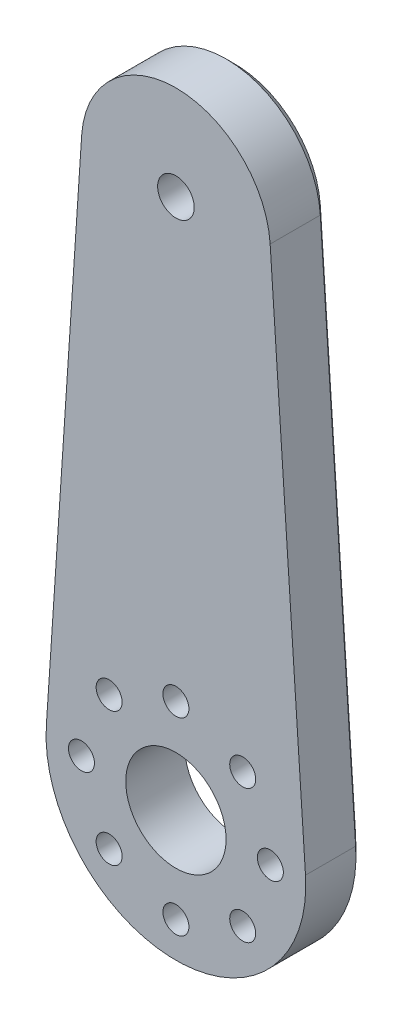
ISO-10303-21;
HEADER;
FILE_DESCRIPTION(('STEP AP214'),'2;1');
FILE_NAME('part.step','',(''),(''),'','','');
FILE_SCHEMA(('AUTOMOTIVE_DESIGN { 1 0 10303 214 1 1 1 1 }'));
ENDSEC;
DATA;
#1=APPLICATION_CONTEXT('core data for automotive mechanical design processes');
#2=APPLICATION_PROTOCOL_DEFINITION('international standard','automotive_design',2000,#1);
#3=PRODUCT_CONTEXT('',#1,'mechanical');
#4=PRODUCT('Part','Part','',(#3));
#5=PRODUCT_RELATED_PRODUCT_CATEGORY('part','',(#4));
#6=PRODUCT_DEFINITION_FORMATION('','',#4);
#7=PRODUCT_DEFINITION_CONTEXT('part definition',#1,'design');
#8=PRODUCT_DEFINITION('design','',#6,#7);
#9=PRODUCT_DEFINITION_SHAPE('','',#8);
#10=(LENGTH_UNIT() NAMED_UNIT(*) SI_UNIT(.MILLI.,.METRE.));
#11=(NAMED_UNIT(*) PLANE_ANGLE_UNIT() SI_UNIT($,.RADIAN.));
#12=(NAMED_UNIT(*) SI_UNIT($,.STERADIAN.) SOLID_ANGLE_UNIT());
#13=UNCERTAINTY_MEASURE_WITH_UNIT(LENGTH_MEASURE(1.E-05),#10,'distance_accuracy_value','');
#14=(GEOMETRIC_REPRESENTATION_CONTEXT(3) GLOBAL_UNCERTAINTY_ASSIGNED_CONTEXT((#13)) GLOBAL_UNIT_ASSIGNED_CONTEXT((#10,
#11,#12)) REPRESENTATION_CONTEXT('',''));
#15=CARTESIAN_POINT('',(0.,0.,0.));
#16=DIRECTION('',(0.,0.,1.));
#17=DIRECTION('',(1.,0.,0.));
#18=AXIS2_PLACEMENT_3D('',#15,#16,#17);
#19=CARTESIAN_POINT('',(-7.13363961110591,-19.1572369352093,5.));
#20=DIRECTION('',(0.,0.,-1.));
#21=DIRECTION('',(-1.,0.,0.));
#22=AXIS2_PLACEMENT_3D('',#19,#20,#21);
#23=CYLINDRICAL_SURFACE('',#22,1.1);
#24=CARTESIAN_POINT('',(-7.13363961110591,-19.1572369352093,5.));
#25=DIRECTION('',(0.,0.,1.));
#26=DIRECTION('',(1.,0.,0.));
#27=AXIS2_PLACEMENT_3D('',#24,#25,#26);
#28=CIRCLE('',#27,1.1);
#29=CARTESIAN_POINT('',(-6.03363961110591,-19.1572369352093,5.));
#30=VERTEX_POINT('',#29);
#31=EDGE_CURVE('E181',#30,#30,#28,.T.);
#32=ORIENTED_EDGE('',*,*,#31,.T.);
#33=EDGE_LOOP('',(#32));
#34=FACE_BOUND('',#33,.T.);
#35=CARTESIAN_POINT('',(-7.13363961110591,-19.1572369352093,2.25));
#36=DIRECTION('',(0.,0.,-1.));
#37=DIRECTION('',(-1.,0.,0.));
#38=AXIS2_PLACEMENT_3D('',#35,#36,#37);
#39=CIRCLE('',#38,1.1);
#40=CARTESIAN_POINT('',(-8.23363961110591,-19.1572369352093,2.25));
#41=VERTEX_POINT('',#40);
#42=EDGE_CURVE('E234',#41,#41,#39,.T.);
#43=ORIENTED_EDGE('',*,*,#42,.T.);
#44=EDGE_LOOP('',(#43));
#45=FACE_BOUND('',#44,.T.);
#46=ADVANCED_FACE('F35',(#34,#45),#23,.F.);
#47=CARTESIAN_POINT('',(-9.47678536161353,-24.8140911847017,5.));
#48=DIRECTION('',(0.,0.,-1.));
#49=DIRECTION('',(-1.,0.,0.));
#50=AXIS2_PLACEMENT_3D('',#47,#48,#49);
#51=CYLINDRICAL_SURFACE('',#50,1.1);
#52=CARTESIAN_POINT('',(-9.47678536161353,-24.8140911847017,5.));
#53=DIRECTION('',(0.,0.,1.));
#54=DIRECTION('',(1.,0.,0.));
#55=AXIS2_PLACEMENT_3D('',#52,#53,#54);
#56=CIRCLE('',#55,1.1);
#57=CARTESIAN_POINT('',(-8.37678536161353,-24.8140911847017,5.));
#58=VERTEX_POINT('',#57);
#59=EDGE_CURVE('E178',#58,#58,#56,.T.);
#60=ORIENTED_EDGE('',*,*,#59,.T.);
#61=EDGE_LOOP('',(#60));
#62=FACE_BOUND('',#61,.T.);
#63=CARTESIAN_POINT('',(-9.47678536161353,-24.8140911847017,2.25));
#64=DIRECTION('',(0.,0.,-1.));
#65=DIRECTION('',(-1.,0.,0.));
#66=AXIS2_PLACEMENT_3D('',#63,#64,#65);
#67=CIRCLE('',#66,1.1);
#68=CARTESIAN_POINT('',(-10.5767853616135,-24.8140911847017,2.25));
#69=VERTEX_POINT('',#68);
#70=EDGE_CURVE('E231',#69,#69,#67,.T.);
#71=ORIENTED_EDGE('',*,*,#70,.T.);
#72=EDGE_LOOP('',(#71));
#73=FACE_BOUND('',#72,.T.);
#74=ADVANCED_FACE('F332',(#62,#73),#51,.F.);
#75=CARTESIAN_POINT('',(-15.1336396111059,-27.1572369352093,5.));
#76=DIRECTION('',(0.,0.,-1.));
#77=DIRECTION('',(-1.,0.,0.));
#78=AXIS2_PLACEMENT_3D('',#75,#76,#77);
#79=CYLINDRICAL_SURFACE('',#78,1.1);
#80=CARTESIAN_POINT('',(-15.1336396111059,-27.1572369352093,5.));
#81=DIRECTION('',(0.,0.,1.));
#82=DIRECTION('',(1.,0.,0.));
#83=AXIS2_PLACEMENT_3D('',#80,#81,#82);
#84=CIRCLE('',#83,1.1);
#85=CARTESIAN_POINT('',(-14.0336396111059,-27.1572369352093,5.));
#86=VERTEX_POINT('',#85);
#87=EDGE_CURVE('E175',#86,#86,#84,.T.);
#88=ORIENTED_EDGE('',*,*,#87,.T.);
#89=EDGE_LOOP('',(#88));
#90=FACE_BOUND('',#89,.T.);
#91=CARTESIAN_POINT('',(-15.1336396111059,-27.1572369352093,2.25));
#92=DIRECTION('',(0.,0.,-1.));
#93=DIRECTION('',(-1.,0.,0.));
#94=AXIS2_PLACEMENT_3D('',#91,#92,#93);
#95=CIRCLE('',#94,1.1);
#96=CARTESIAN_POINT('',(-16.2336396111059,-27.1572369352093,2.25));
#97=VERTEX_POINT('',#96);
#98=EDGE_CURVE('E228',#97,#97,#95,.T.);
#99=ORIENTED_EDGE('',*,*,#98,.T.);
#100=EDGE_LOOP('',(#99));
#101=FACE_BOUND('',#100,.T.);
#102=ADVANCED_FACE('F338',(#90,#101),#79,.F.);
#103=CARTESIAN_POINT('',(-20.7904938605983,-24.8140911847017,5.));
#104=DIRECTION('',(0.,0.,-1.));
#105=DIRECTION('',(-1.,0.,0.));
#106=AXIS2_PLACEMENT_3D('',#103,#104,#105);
#107=CYLINDRICAL_SURFACE('',#106,1.1);
#108=CARTESIAN_POINT('',(-20.7904938605983,-24.8140911847017,5.));
#109=DIRECTION('',(0.,0.,1.));
#110=DIRECTION('',(1.,0.,0.));
#111=AXIS2_PLACEMENT_3D('',#108,#109,#110);
#112=CIRCLE('',#111,1.1);
#113=CARTESIAN_POINT('',(-19.6904938605983,-24.8140911847017,5.));
#114=VERTEX_POINT('',#113);
#115=EDGE_CURVE('E172',#114,#114,#112,.T.);
#116=ORIENTED_EDGE('',*,*,#115,.T.);
#117=EDGE_LOOP('',(#116));
#118=FACE_BOUND('',#117,.T.);
#119=CARTESIAN_POINT('',(-20.7904938605983,-24.8140911847017,2.25));
#120=DIRECTION('',(0.,0.,-1.));
#121=DIRECTION('',(-1.,0.,0.));
#122=AXIS2_PLACEMENT_3D('',#119,#120,#121);
#123=CIRCLE('',#122,1.1);
#124=CARTESIAN_POINT('',(-21.8904938605983,-24.8140911847017,2.25));
#125=VERTEX_POINT('',#124);
#126=EDGE_CURVE('E225',#125,#125,#123,.T.);
#127=ORIENTED_EDGE('',*,*,#126,.T.);
#128=EDGE_LOOP('',(#127));
#129=FACE_BOUND('',#128,.T.);
#130=ADVANCED_FACE('F724',(#118,#129),#107,.F.);
#131=CARTESIAN_POINT('',(-23.1336396111059,-19.1572369352093,5.));
#132=DIRECTION('',(0.,0.,-1.));
#133=DIRECTION('',(-1.,0.,0.));
#134=AXIS2_PLACEMENT_3D('',#131,#132,#133);
#135=CYLINDRICAL_SURFACE('',#134,1.1);
#136=CARTESIAN_POINT('',(-23.1336396111059,-19.1572369352093,5.));
#137=DIRECTION('',(0.,0.,1.));
#138=DIRECTION('',(1.,0.,0.));
#139=AXIS2_PLACEMENT_3D('',#136,#137,#138);
#140=CIRCLE('',#139,1.1);
#141=CARTESIAN_POINT('',(-22.0336396111059,-19.1572369352093,5.));
#142=VERTEX_POINT('',#141);
#143=EDGE_CURVE('E169',#142,#142,#140,.T.);
#144=ORIENTED_EDGE('',*,*,#143,.T.);
#145=EDGE_LOOP('',(#144));
#146=FACE_BOUND('',#145,.T.);
#147=CARTESIAN_POINT('',(-23.1336396111059,-19.1572369352093,2.25));
#148=DIRECTION('',(0.,0.,-1.));
#149=DIRECTION('',(-1.,0.,0.));
#150=AXIS2_PLACEMENT_3D('',#147,#148,#149);
#151=CIRCLE('',#150,1.1);
#152=CARTESIAN_POINT('',(-24.2336396111059,-19.1572369352093,2.25));
#153=VERTEX_POINT('',#152);
#154=EDGE_CURVE('E222',#153,#153,#151,.T.);
#155=ORIENTED_EDGE('',*,*,#154,.T.);
#156=EDGE_LOOP('',(#155));
#157=FACE_BOUND('',#156,.T.);
#158=ADVANCED_FACE('F733',(#146,#157),#135,.F.);
#159=CARTESIAN_POINT('',(-20.7904938605983,-13.5003826857169,5.));
#160=DIRECTION('',(0.,0.,-1.));
#161=DIRECTION('',(-1.,0.,0.));
#162=AXIS2_PLACEMENT_3D('',#159,#160,#161);
#163=CYLINDRICAL_SURFACE('',#162,1.1);
#164=CARTESIAN_POINT('',(-20.7904938605983,-13.5003826857169,5.));
#165=DIRECTION('',(0.,0.,1.));
#166=DIRECTION('',(1.,0.,0.));
#167=AXIS2_PLACEMENT_3D('',#164,#165,#166);
#168=CIRCLE('',#167,1.1);
#169=CARTESIAN_POINT('',(-19.6904938605983,-13.5003826857169,5.));
#170=VERTEX_POINT('',#169);
#171=EDGE_CURVE('E166',#170,#170,#168,.T.);
#172=ORIENTED_EDGE('',*,*,#171,.T.);
#173=EDGE_LOOP('',(#172));
#174=FACE_BOUND('',#173,.T.);
#175=CARTESIAN_POINT('',(-20.7904938605983,-13.5003826857169,2.25));
#176=DIRECTION('',(0.,0.,-1.));
#177=DIRECTION('',(-1.,0.,0.));
#178=AXIS2_PLACEMENT_3D('',#175,#176,#177);
#179=CIRCLE('',#178,1.1);
#180=CARTESIAN_POINT('',(-21.8904938605983,-13.5003826857169,2.25));
#181=VERTEX_POINT('',#180);
#182=EDGE_CURVE('E219',#181,#181,#179,.T.);
#183=ORIENTED_EDGE('',*,*,#182,.T.);
#184=EDGE_LOOP('',(#183));
#185=FACE_BOUND('',#184,.T.);
#186=ADVANCED_FACE('F743',(#174,#185),#163,.F.);
#187=CARTESIAN_POINT('',(-15.1336396111059,-11.1572369352093,5.));
#188=DIRECTION('',(0.,0.,-1.));
#189=DIRECTION('',(-1.,0.,0.));
#190=AXIS2_PLACEMENT_3D('',#187,#188,#189);
#191=CYLINDRICAL_SURFACE('',#190,1.1);
#192=CARTESIAN_POINT('',(-15.1336396111059,-11.1572369352093,5.));
#193=DIRECTION('',(0.,0.,1.));
#194=DIRECTION('',(1.,0.,0.));
#195=AXIS2_PLACEMENT_3D('',#192,#193,#194);
#196=CIRCLE('',#195,1.1);
#197=CARTESIAN_POINT('',(-14.0336396111059,-11.1572369352093,5.));
#198=VERTEX_POINT('',#197);
#199=EDGE_CURVE('E163',#198,#198,#196,.T.);
#200=ORIENTED_EDGE('',*,*,#199,.T.);
#201=EDGE_LOOP('',(#200));
#202=FACE_BOUND('',#201,.T.);
#203=CARTESIAN_POINT('',(-15.1336396111059,-11.1572369352093,2.25));
#204=DIRECTION('',(0.,0.,-1.));
#205=DIRECTION('',(-1.,0.,0.));
#206=AXIS2_PLACEMENT_3D('',#203,#204,#205);
#207=CIRCLE('',#206,1.1);
#208=CARTESIAN_POINT('',(-16.2336396111059,-11.1572369352093,2.25));
#209=VERTEX_POINT('',#208);
#210=EDGE_CURVE('E215',#209,#209,#207,.T.);
#211=ORIENTED_EDGE('',*,*,#210,.T.);
#212=EDGE_LOOP('',(#211));
#213=FACE_BOUND('',#212,.T.);
#214=ADVANCED_FACE('F418',(#202,#213),#191,.F.);
#215=CARTESIAN_POINT('',(-9.47678536161353,-13.5003826857169,5.));
#216=DIRECTION('',(0.,0.,-1.));
#217=DIRECTION('',(-1.,0.,0.));
#218=AXIS2_PLACEMENT_3D('',#215,#216,#217);
#219=CYLINDRICAL_SURFACE('',#218,1.1);
#220=CARTESIAN_POINT('',(-9.47678536161353,-13.5003826857169,5.));
#221=DIRECTION('',(0.,0.,1.));
#222=DIRECTION('',(1.,0.,0.));
#223=AXIS2_PLACEMENT_3D('',#220,#221,#222);
#224=CIRCLE('',#223,1.1);
#225=CARTESIAN_POINT('',(-8.37678536161353,-13.5003826857169,5.));
#226=VERTEX_POINT('',#225);
#227=EDGE_CURVE('E155',#226,#226,#224,.T.);
#228=ORIENTED_EDGE('',*,*,#227,.T.);
#229=EDGE_LOOP('',(#228));
#230=FACE_BOUND('',#229,.T.);
#231=CARTESIAN_POINT('',(-9.47678536161353,-13.5003826857169,2.25));
#232=DIRECTION('',(0.,0.,-1.));
#233=DIRECTION('',(-1.,0.,0.));
#234=AXIS2_PLACEMENT_3D('',#231,#232,#233);
#235=CIRCLE('',#234,1.1);
#236=CARTESIAN_POINT('',(-10.5767853616135,-13.5003826857169,2.25));
#237=VERTEX_POINT('',#236);
#238=EDGE_CURVE('E212',#237,#237,#235,.T.);
#239=ORIENTED_EDGE('',*,*,#238,.T.);
#240=EDGE_LOOP('',(#239));
#241=FACE_BOUND('',#240,.T.);
#242=ADVANCED_FACE('F360',(#230,#241),#219,.F.);
#243=CARTESIAN_POINT('',(-15.1336396111059,25.8427630647907,0.));
#244=DIRECTION('',(0.,0.,1.));
#245=DIRECTION('',(1.,0.,0.));
#246=AXIS2_PLACEMENT_3D('',#243,#244,#245);
#247=PLANE('',#246);
#248=CARTESIAN_POINT('',(-15.1336396111059,-19.1572369352093,0.));
#249=DIRECTION('',(0.,0.,1.));
#250=DIRECTION('',(1.,0.,0.));
#251=AXIS2_PLACEMENT_3D('',#248,#249,#250);
#252=CIRCLE('',#251,10.25);
#253=CARTESIAN_POINT('',(-4.9064427539238,-18.4739036018759,0.));
#254=VERTEX_POINT('',#253);
#255=CARTESIAN_POINT('',(-25.360836468288,-18.4739036018759,0.));
#256=VERTEX_POINT('',#255);
#257=EDGE_CURVE('E244',#254,#256,#252,.F.);
#258=ORIENTED_EDGE('',*,*,#257,.T.);
#259=DIRECTION('',(0.0666666666666667,0.997775303139718,0.));
#260=VECTOR('',#259,1.);
#261=CARTESIAN_POINT('',(-22.3675105588689,26.3260963981241,0.));
#262=LINE('',#261,#260);
#263=CARTESIAN_POINT('',(-22.3675105588689,26.3260963981241,0.));
#264=VERTEX_POINT('',#263);
#265=EDGE_CURVE('E246',#256,#264,#262,.T.);
#266=ORIENTED_EDGE('',*,*,#265,.T.);
#267=CARTESIAN_POINT('',(-15.1336396111059,25.8427630647907,0.));
#268=DIRECTION('',(0.,0.,1.));
#269=DIRECTION('',(1.,0.,0.));
#270=AXIS2_PLACEMENT_3D('',#267,#268,#269);
#271=CIRCLE('',#270,7.25);
#272=CARTESIAN_POINT('',(-7.89976866334295,26.3260963981241,0.));
#273=VERTEX_POINT('',#272);
#274=EDGE_CURVE('E242',#264,#273,#271,.F.);
#275=ORIENTED_EDGE('',*,*,#274,.T.);
#276=DIRECTION('',(0.0666666666666666,-0.997775303139718,0.));
#277=VECTOR('',#276,1.);
#278=CARTESIAN_POINT('',(-7.89976866334295,26.3260963981241,0.));
#279=LINE('',#278,#277);
#280=EDGE_CURVE('E240',#273,#254,#279,.T.);
#281=ORIENTED_EDGE('',*,*,#280,.T.);
#282=EDGE_LOOP('',(#258,#266,#275,#281));
#283=FACE_BOUND('',#282,.T.);
#284=CARTESIAN_POINT('',(-20.7904938605983,-13.5003826857169,0.));
#285=DIRECTION('',(0.,0.,-1.));
#286=DIRECTION('',(-1.,0.,0.));
#287=AXIS2_PLACEMENT_3D('',#284,#285,#286);
#288=CIRCLE('',#287,1.75);
#289=CARTESIAN_POINT('',(-22.5404938605983,-13.5003826857169,0.));
#290=VERTEX_POINT('',#289);
#291=EDGE_CURVE('E260',#290,#290,#288,.T.);
#292=ORIENTED_EDGE('',*,*,#291,.F.);
#293=EDGE_LOOP('',(#292));
#294=FACE_BOUND('',#293,.T.);
#295=CARTESIAN_POINT('',(-15.1336396111059,-11.1572369352093,0.));
#296=DIRECTION('',(0.,0.,-1.));
#297=DIRECTION('',(-1.,0.,0.));
#298=AXIS2_PLACEMENT_3D('',#295,#296,#297);
#299=CIRCLE('',#298,1.75);
#300=CARTESIAN_POINT('',(-16.8836396111059,-11.1572369352093,0.));
#301=VERTEX_POINT('',#300);
#302=EDGE_CURVE('E271',#301,#301,#299,.T.);
#303=ORIENTED_EDGE('',*,*,#302,.F.);
#304=EDGE_LOOP('',(#303));
#305=FACE_BOUND('',#304,.T.);
#306=CARTESIAN_POINT('',(-9.47678536161353,-13.5003826857169,0.));
#307=DIRECTION('',(0.,0.,-1.));
#308=DIRECTION('',(-1.,0.,0.));
#309=AXIS2_PLACEMENT_3D('',#306,#307,#308);
#310=CIRCLE('',#309,1.75);
#311=CARTESIAN_POINT('',(-11.2267853616135,-13.5003826857169,0.));
#312=VERTEX_POINT('',#311);
#313=EDGE_CURVE('E433',#312,#312,#310,.T.);
#314=ORIENTED_EDGE('',*,*,#313,.F.);
#315=EDGE_LOOP('',(#314));
#316=FACE_BOUND('',#315,.T.);
#317=CARTESIAN_POINT('',(-7.13363961110591,-19.1572369352093,0.));
#318=DIRECTION('',(0.,0.,-1.));
#319=DIRECTION('',(-1.,0.,0.));
#320=AXIS2_PLACEMENT_3D('',#317,#318,#319);
#321=CIRCLE('',#320,1.75);
#322=CARTESIAN_POINT('',(-8.88363961110591,-19.1572369352093,0.));
#323=VERTEX_POINT('',#322);
#324=EDGE_CURVE('E432',#323,#323,#321,.T.);
#325=ORIENTED_EDGE('',*,*,#324,.F.);
#326=EDGE_LOOP('',(#325));
#327=FACE_BOUND('',#326,.T.);
#328=CARTESIAN_POINT('',(-9.47678536161352,-24.8140911847017,0.));
#329=DIRECTION('',(0.,0.,-1.));
#330=DIRECTION('',(-1.,0.,0.));
#331=AXIS2_PLACEMENT_3D('',#328,#329,#330);
#332=CIRCLE('',#331,1.75);
#333=CARTESIAN_POINT('',(-11.2267853616135,-24.8140911847017,0.));
#334=VERTEX_POINT('',#333);
#335=EDGE_CURVE('E456',#334,#334,#332,.T.);
#336=ORIENTED_EDGE('',*,*,#335,.F.);
#337=EDGE_LOOP('',(#336));
#338=FACE_BOUND('',#337,.T.);
#339=CARTESIAN_POINT('',(-15.1336396111059,-27.1572369352093,0.));
#340=DIRECTION('',(0.,0.,-1.));
#341=DIRECTION('',(-1.,0.,0.));
#342=AXIS2_PLACEMENT_3D('',#339,#340,#341);
#343=CIRCLE('',#342,1.75);
#344=CARTESIAN_POINT('',(-16.8836396111059,-27.1572369352093,0.));
#345=VERTEX_POINT('',#344);
#346=EDGE_CURVE('E460',#345,#345,#343,.T.);
#347=ORIENTED_EDGE('',*,*,#346,.F.);
#348=EDGE_LOOP('',(#347));
#349=FACE_BOUND('',#348,.T.);
#350=CARTESIAN_POINT('',(-20.7904938605983,-24.8140911847016,0.));
#351=DIRECTION('',(0.,0.,-1.));
#352=DIRECTION('',(-1.,0.,0.));
#353=AXIS2_PLACEMENT_3D('',#350,#351,#352);
#354=CIRCLE('',#353,1.74999999999999);
#355=CARTESIAN_POINT('',(-22.5404938605983,-24.8140911847016,0.));
#356=VERTEX_POINT('',#355);
#357=EDGE_CURVE('E464',#356,#356,#354,.T.);
#358=ORIENTED_EDGE('',*,*,#357,.F.);
#359=EDGE_LOOP('',(#358));
#360=FACE_BOUND('',#359,.T.);
#361=CARTESIAN_POINT('',(-23.1336396111059,-19.1572369352093,0.));
#362=DIRECTION('',(0.,0.,-1.));
#363=DIRECTION('',(-1.,0.,0.));
#364=AXIS2_PLACEMENT_3D('',#361,#362,#363);
#365=CIRCLE('',#364,1.75);
#366=CARTESIAN_POINT('',(-24.8836396111059,-19.1572369352093,0.));
#367=VERTEX_POINT('',#366);
#368=EDGE_CURVE('E277',#367,#367,#365,.T.);
#369=ORIENTED_EDGE('',*,*,#368,.F.);
#370=EDGE_LOOP('',(#369));
#371=FACE_BOUND('',#370,.T.);
#372=CARTESIAN_POINT('',(-15.1336396111059,-19.1572369352093,0.));
#373=DIRECTION('',(0.,0.,1.));
#374=DIRECTION('',(1.,0.,0.));
#375=AXIS2_PLACEMENT_3D('',#372,#373,#374);
#376=CIRCLE('',#375,4.25);
#377=CARTESIAN_POINT('',(-10.8836396111059,-19.1572369352093,0.));
#378=VERTEX_POINT('',#377);
#379=EDGE_CURVE('E184',#378,#378,#376,.T.);
#380=ORIENTED_EDGE('',*,*,#379,.T.);
#381=EDGE_LOOP('',(#380));
#382=FACE_BOUND('',#381,.T.);
#383=DIRECTION('',(1.,0.,0.));
#384=VECTOR('',#383,1.);
#385=CARTESIAN_POINT('',(-16.7213528513774,23.0927630647907,0.));
#386=LINE('',#385,#384);
#387=CARTESIAN_POINT('',(-16.7213528513774,23.0927630647907,0.));
#388=VERTEX_POINT('',#387);
#389=CARTESIAN_POINT('',(-13.5459263708344,23.0927630647907,0.));
#390=VERTEX_POINT('',#389);
#391=EDGE_CURVE('E237',#388,#390,#386,.T.);
#392=ORIENTED_EDGE('',*,*,#391,.T.);
#393=DIRECTION('',(0.5,0.866025403784439,0.));
#394=VECTOR('',#393,1.);
#395=CARTESIAN_POINT('',(-13.5459263708344,23.0927630647907,0.));
#396=LINE('',#395,#394);
#397=CARTESIAN_POINT('',(-11.958213130563,25.8427630647907,0.));
#398=VERTEX_POINT('',#397);
#399=EDGE_CURVE('E150',#390,#398,#396,.T.);
#400=ORIENTED_EDGE('',*,*,#399,.T.);
#401=DIRECTION('',(-0.5,0.866025403784438,0.));
#402=VECTOR('',#401,1.);
#403=CARTESIAN_POINT('',(-11.958213130563,25.8427630647907,0.));
#404=LINE('',#403,#402);
#405=CARTESIAN_POINT('',(-13.5459263708344,28.5927630647907,0.));
#406=VERTEX_POINT('',#405);
#407=EDGE_CURVE('E290',#398,#406,#404,.T.);
#408=ORIENTED_EDGE('',*,*,#407,.T.);
#409=DIRECTION('',(-1.,0.,0.));
#410=VECTOR('',#409,1.);
#411=CARTESIAN_POINT('',(-13.5459263708344,28.5927630647907,0.));
#412=LINE('',#411,#410);
#413=CARTESIAN_POINT('',(-16.7213528513774,28.5927630647907,0.));
#414=VERTEX_POINT('',#413);
#415=EDGE_CURVE('E293',#406,#414,#412,.T.);
#416=ORIENTED_EDGE('',*,*,#415,.T.);
#417=DIRECTION('',(-0.500000000000001,-0.866025403784438,0.));
#418=VECTOR('',#417,1.);
#419=CARTESIAN_POINT('',(-16.7213528513774,28.5927630647907,0.));
#420=LINE('',#419,#418);
#421=CARTESIAN_POINT('',(-18.3090660916489,25.8427630647907,0.));
#422=VERTEX_POINT('',#421);
#423=EDGE_CURVE('E296',#414,#422,#420,.T.);
#424=ORIENTED_EDGE('',*,*,#423,.T.);
#425=DIRECTION('',(0.499999999999999,-0.866025403784439,0.));
#426=VECTOR('',#425,1.);
#427=CARTESIAN_POINT('',(-18.3090660916489,25.8427630647907,0.));
#428=LINE('',#427,#426);
#429=EDGE_CURVE('E146',#422,#388,#428,.T.);
#430=ORIENTED_EDGE('',*,*,#429,.T.);
#431=EDGE_LOOP('',(#392,#400,#408,#416,#424,#430));
#432=FACE_BOUND('',#431,.T.);
#433=ADVANCED_FACE('F315',(#283,#294,#305,#316,#327,#338,#349,#360,#371,#382,#432),#247,.F.);
#434=CARTESIAN_POINT('',(-15.1336396111059,25.8427630647907,5.));
#435=DIRECTION('',(0.,0.,1.));
#436=DIRECTION('',(1.,0.,0.));
#437=AXIS2_PLACEMENT_3D('',#434,#435,#436);
#438=PLANE('',#437);
#439=ORIENTED_EDGE('',*,*,#199,.F.);
#440=EDGE_LOOP('',(#439));
#441=FACE_BOUND('',#440,.T.);
#442=ORIENTED_EDGE('',*,*,#143,.F.);
#443=EDGE_LOOP('',(#442));
#444=FACE_BOUND('',#443,.T.);
#445=ORIENTED_EDGE('',*,*,#87,.F.);
#446=EDGE_LOOP('',(#445));
#447=FACE_BOUND('',#446,.T.);
#448=ORIENTED_EDGE('',*,*,#31,.F.);
#449=EDGE_LOOP('',(#448));
#450=FACE_BOUND('',#449,.T.);
#451=CARTESIAN_POINT('',(-15.1336396111059,25.8427630647907,5.));
#452=DIRECTION('',(0.,0.,1.));
#453=DIRECTION('',(1.,0.,0.));
#454=AXIS2_PLACEMENT_3D('',#451,#452,#453);
#455=CIRCLE('',#454,1.55);
#456=CARTESIAN_POINT('',(-13.5836396111059,25.8427630647907,5.));
#457=VERTEX_POINT('',#456);
#458=EDGE_CURVE('E188',#457,#457,#455,.T.);
#459=ORIENTED_EDGE('',*,*,#458,.F.);
#460=EDGE_LOOP('',(#459));
#461=FACE_BOUND('',#460,.T.);
#462=CARTESIAN_POINT('',(-15.1336396111059,25.8427630647907,5.));
#463=DIRECTION('',(0.,0.,1.));
#464=DIRECTION('',(1.,0.,0.));
#465=AXIS2_PLACEMENT_3D('',#462,#463,#464);
#466=CIRCLE('',#465,8.);
#467=CARTESIAN_POINT('',(-7.15143718598816,26.3760963981241,5.));
#468=VERTEX_POINT('',#467);
#469=CARTESIAN_POINT('',(-23.1158420362236,26.3760963981241,5.));
#470=VERTEX_POINT('',#469);
#471=EDGE_CURVE('E193',#468,#470,#466,.T.);
#472=ORIENTED_EDGE('',*,*,#471,.T.);
#473=DIRECTION('',(-0.0666666666666667,-0.997775303139718,0.));
#474=VECTOR('',#473,1.);
#475=CARTESIAN_POINT('',(-23.1158420362236,26.3760963981241,5.));
#476=LINE('',#475,#474);
#477=CARTESIAN_POINT('',(-26.1091679456428,-18.4239036018759,5.));
#478=VERTEX_POINT('',#477);
#479=EDGE_CURVE('E196',#470,#478,#476,.T.);
#480=ORIENTED_EDGE('',*,*,#479,.T.);
#481=CARTESIAN_POINT('',(-15.1336396111059,-19.1572369352093,5.));
#482=DIRECTION('',(0.,0.,1.));
#483=DIRECTION('',(1.,0.,0.));
#484=AXIS2_PLACEMENT_3D('',#481,#482,#483);
#485=CIRCLE('',#484,11.);
#486=CARTESIAN_POINT('',(-4.15811127656901,-18.4239036018759,5.));
#487=VERTEX_POINT('',#486);
#488=EDGE_CURVE('E198',#478,#487,#485,.T.);
#489=ORIENTED_EDGE('',*,*,#488,.T.);
#490=DIRECTION('',(-0.0666666666666666,0.997775303139718,0.));
#491=VECTOR('',#490,1.);
#492=CARTESIAN_POINT('',(-7.15143718598816,26.3760963981241,5.));
#493=LINE('',#492,#491);
#494=EDGE_CURVE('E200',#487,#468,#493,.T.);
#495=ORIENTED_EDGE('',*,*,#494,.T.);
#496=EDGE_LOOP('',(#472,#480,#489,#495));
#497=FACE_BOUND('',#496,.T.);
#498=CARTESIAN_POINT('',(-15.1336396111059,-19.1572369352093,5.));
#499=DIRECTION('',(0.,0.,1.));
#500=DIRECTION('',(1.,0.,0.));
#501=AXIS2_PLACEMENT_3D('',#498,#499,#500);
#502=CIRCLE('',#501,4.25);
#503=CARTESIAN_POINT('',(-10.8836396111059,-19.1572369352093,5.));
#504=VERTEX_POINT('',#503);
#505=EDGE_CURVE('E185',#504,#504,#502,.T.);
#506=ORIENTED_EDGE('',*,*,#505,.F.);
#507=EDGE_LOOP('',(#506));
#508=FACE_BOUND('',#507,.T.);
#509=ORIENTED_EDGE('',*,*,#59,.F.);
#510=EDGE_LOOP('',(#509));
#511=FACE_BOUND('',#510,.T.);
#512=ORIENTED_EDGE('',*,*,#115,.F.);
#513=EDGE_LOOP('',(#512));
#514=FACE_BOUND('',#513,.T.);
#515=ORIENTED_EDGE('',*,*,#171,.F.);
#516=EDGE_LOOP('',(#515));
#517=FACE_BOUND('',#516,.T.);
#518=ORIENTED_EDGE('',*,*,#227,.F.);
#519=EDGE_LOOP('',(#518));
#520=FACE_BOUND('',#519,.T.);
#521=ADVANCED_FACE('F353',(#441,#444,#447,#450,#461,#497,#508,#511,#514,#517,#520),#438,.T.);
#522=CARTESIAN_POINT('',(-15.1336396111059,25.8427630647907,5.));
#523=DIRECTION('',(0.,0.,-1.));
#524=DIRECTION('',(-1.,0.,0.));
#525=AXIS2_PLACEMENT_3D('',#522,#523,#524);
#526=CYLINDRICAL_SURFACE('',#525,8.);
#527=DIRECTION('',(0.,0.,-1.));
#528=VECTOR('',#527,1.);
#529=CARTESIAN_POINT('',(-7.15143718598816,26.3760963981241,5.));
#530=LINE('',#529,#528);
#531=CARTESIAN_POINT('',(-7.15143718598816,26.3760963981241,0.749999999999994));
#532=VERTEX_POINT('',#531);
#533=EDGE_CURVE('E202',#468,#532,#530,.T.);
#534=ORIENTED_EDGE('',*,*,#533,.T.);
#535=CARTESIAN_POINT('',(-15.1336396111059,25.8427630647907,0.749999999999994));
#536=DIRECTION('',(0.,0.,1.));
#537=DIRECTION('',(1.,0.,0.));
#538=AXIS2_PLACEMENT_3D('',#535,#536,#537);
#539=CIRCLE('',#538,8.);
#540=CARTESIAN_POINT('',(-23.1158420362236,26.3760963981241,0.749999999999994));
#541=VERTEX_POINT('',#540);
#542=EDGE_CURVE('E44',#532,#541,#539,.T.);
#543=ORIENTED_EDGE('',*,*,#542,.T.);
#544=DIRECTION('',(0.,0.,-1.));
#545=VECTOR('',#544,1.);
#546=CARTESIAN_POINT('',(-23.1158420362236,26.3760963981241,5.));
#547=LINE('',#546,#545);
#548=EDGE_CURVE('E208',#470,#541,#547,.T.);
#549=ORIENTED_EDGE('',*,*,#548,.F.);
#550=ORIENTED_EDGE('',*,*,#471,.F.);
#551=EDGE_LOOP('',(#534,#543,#549,#550));
#552=FACE_BOUND('',#551,.T.);
#553=ADVANCED_FACE('F356',(#552),#526,.T.);
#554=CARTESIAN_POINT('',(-23.1158420362236,26.3760963981241,5.));
#555=DIRECTION('',(0.997775303139718,-0.0666666666666667,0.));
#556=DIRECTION('',(0.0666666666666667,0.997775303139718,0.));
#557=AXIS2_PLACEMENT_3D('',#554,#555,#556);
#558=PLANE('',#557);
#559=ORIENTED_EDGE('',*,*,#548,.T.);
#560=DIRECTION('',(-0.0666666666666667,-0.997775303139718,0.));
#561=VECTOR('',#560,1.);
#562=CARTESIAN_POINT('',(-23.1158420362236,26.3760963981241,0.749999999999994));
#563=LINE('',#562,#561);
#564=CARTESIAN_POINT('',(-26.1091679456428,-18.4239036018759,0.749999999999994));
#565=VERTEX_POINT('',#564);
#566=EDGE_CURVE('E210',#541,#565,#563,.T.);
#567=ORIENTED_EDGE('',*,*,#566,.T.);
#568=DIRECTION('',(0.,0.,-1.));
#569=VECTOR('',#568,1.);
#570=CARTESIAN_POINT('',(-26.1091679456428,-18.4239036018759,5.));
#571=LINE('',#570,#569);
#572=EDGE_CURVE('E206',#478,#565,#571,.T.);
#573=ORIENTED_EDGE('',*,*,#572,.F.);
#574=ORIENTED_EDGE('',*,*,#479,.F.);
#575=EDGE_LOOP('',(#559,#567,#573,#574));
#576=FACE_BOUND('',#575,.T.);
#577=ADVANCED_FACE('F367',(#576),#558,.F.);
#578=CARTESIAN_POINT('',(-15.1336396111059,-19.1572369352093,5.));
#579=DIRECTION('',(0.,0.,-1.));
#580=DIRECTION('',(-1.,0.,0.));
#581=AXIS2_PLACEMENT_3D('',#578,#579,#580);
#582=CYLINDRICAL_SURFACE('',#581,11.);
#583=ORIENTED_EDGE('',*,*,#572,.T.);
#584=CARTESIAN_POINT('',(-15.1336396111059,-19.1572369352093,0.749999999999994));
#585=DIRECTION('',(0.,0.,1.));
#586=DIRECTION('',(1.,0.,0.));
#587=AXIS2_PLACEMENT_3D('',#584,#585,#586);
#588=CIRCLE('',#587,11.);
#589=CARTESIAN_POINT('',(-4.15811127656901,-18.4239036018759,0.749999999999994));
#590=VERTEX_POINT('',#589);
#591=EDGE_CURVE('E58',#565,#590,#588,.T.);
#592=ORIENTED_EDGE('',*,*,#591,.T.);
#593=DIRECTION('',(0.,0.,-1.));
#594=VECTOR('',#593,1.);
#595=CARTESIAN_POINT('',(-4.15811127656901,-18.4239036018759,5.));
#596=LINE('',#595,#594);
#597=EDGE_CURVE('E204',#487,#590,#596,.T.);
#598=ORIENTED_EDGE('',*,*,#597,.F.);
#599=ORIENTED_EDGE('',*,*,#488,.F.);
#600=EDGE_LOOP('',(#583,#592,#598,#599));
#601=FACE_BOUND('',#600,.T.);
#602=ADVANCED_FACE('F364',(#601),#582,.T.);
#603=CARTESIAN_POINT('',(-7.15143718598816,26.3760963981241,5.));
#604=DIRECTION('',(-0.997775303139718,-0.0666666666666666,0.));
#605=DIRECTION('',(0.0666666666666666,-0.997775303139718,0.));
#606=AXIS2_PLACEMENT_3D('',#603,#604,#605);
#607=PLANE('',#606);
#608=ORIENTED_EDGE('',*,*,#597,.T.);
#609=DIRECTION('',(-0.0666666666666666,0.997775303139718,0.));
#610=VECTOR('',#609,1.);
#611=CARTESIAN_POINT('',(-7.15143718598816,26.3760963981241,0.749999999999994));
#612=LINE('',#611,#610);
#613=EDGE_CURVE('E11',#590,#532,#612,.T.);
#614=ORIENTED_EDGE('',*,*,#613,.T.);
#615=ORIENTED_EDGE('',*,*,#533,.F.);
#616=ORIENTED_EDGE('',*,*,#494,.F.);
#617=EDGE_LOOP('',(#608,#614,#615,#616));
#618=FACE_BOUND('',#617,.T.);
#619=ADVANCED_FACE('F351',(#618),#607,.F.);
#620=CARTESIAN_POINT('',(-15.1336396111059,25.8427630647907,5.));
#621=DIRECTION('',(0.,0.,-1.));
#622=DIRECTION('',(-1.,0.,0.));
#623=AXIS2_PLACEMENT_3D('',#620,#621,#622);
#624=CYLINDRICAL_SURFACE('',#623,1.55);
#625=CARTESIAN_POINT('',(-15.1336396111059,25.8427630647907,2.));
#626=DIRECTION('',(0.,0.,1.));
#627=DIRECTION('',(1.,0.,0.));
#628=AXIS2_PLACEMENT_3D('',#625,#626,#627);
#629=CIRCLE('',#628,1.55);
#630=CARTESIAN_POINT('',(-13.5836396111059,25.8427630647907,2.));
#631=VERTEX_POINT('',#630);
#632=EDGE_CURVE('E151',#631,#631,#629,.T.);
#633=ORIENTED_EDGE('',*,*,#632,.F.);
#634=EDGE_LOOP('',(#633));
#635=FACE_BOUND('',#634,.T.);
#636=ORIENTED_EDGE('',*,*,#458,.T.);
#637=EDGE_LOOP('',(#636));
#638=FACE_BOUND('',#637,.T.);
#639=ADVANCED_FACE('F347',(#635,#638),#624,.F.);
#640=CARTESIAN_POINT('',(-15.1336396111059,-19.1572369352093,5.));
#641=DIRECTION('',(0.,0.,-1.));
#642=DIRECTION('',(-1.,0.,0.));
#643=AXIS2_PLACEMENT_3D('',#640,#641,#642);
#644=CYLINDRICAL_SURFACE('',#643,4.25);
#645=ORIENTED_EDGE('',*,*,#505,.T.);
#646=EDGE_LOOP('',(#645));
#647=FACE_BOUND('',#646,.T.);
#648=ORIENTED_EDGE('',*,*,#379,.F.);
#649=EDGE_LOOP('',(#648));
#650=FACE_BOUND('',#649,.T.);
#651=ADVANCED_FACE('F344',(#647,#650),#644,.F.);
#652=CARTESIAN_POINT('',(-16.7213528513774,23.0927630647907,2.));
#653=DIRECTION('',(0.,1.,0.));
#654=DIRECTION('',(0.,0.,1.));
#655=AXIS2_PLACEMENT_3D('',#652,#653,#654);
#656=PLANE('',#655);
#657=ORIENTED_EDGE('',*,*,#391,.F.);
#658=DIRECTION('',(0.,0.,-1.));
#659=VECTOR('',#658,1.);
#660=CARTESIAN_POINT('',(-16.7213528513774,23.0927630647907,2.));
#661=LINE('',#660,#659);
#662=CARTESIAN_POINT('',(-16.7213528513774,23.0927630647907,2.));
#663=VERTEX_POINT('',#662);
#664=EDGE_CURVE('E145',#663,#388,#661,.T.);
#665=ORIENTED_EDGE('',*,*,#664,.F.);
#666=DIRECTION('',(1.,0.,0.));
#667=VECTOR('',#666,1.);
#668=CARTESIAN_POINT('',(-16.7213528513774,23.0927630647907,2.));
#669=LINE('',#668,#667);
#670=CARTESIAN_POINT('',(-13.5459263708344,23.0927630647907,2.));
#671=VERTEX_POINT('',#670);
#672=EDGE_CURVE('E131',#663,#671,#669,.T.);
#673=ORIENTED_EDGE('',*,*,#672,.T.);
#674=DIRECTION('',(0.,0.,-1.));
#675=VECTOR('',#674,1.);
#676=CARTESIAN_POINT('',(-13.5459263708344,23.0927630647907,2.));
#677=LINE('',#676,#675);
#678=EDGE_CURVE('E142',#671,#390,#677,.T.);
#679=ORIENTED_EDGE('',*,*,#678,.T.);
#680=EDGE_LOOP('',(#657,#665,#673,#679));
#681=FACE_BOUND('',#680,.T.);
#682=ADVANCED_FACE('F141',(#681),#656,.T.);
#683=CARTESIAN_POINT('',(-13.5459263708344,23.0927630647907,2.));
#684=DIRECTION('',(-0.866025403784439,0.5,0.));
#685=DIRECTION('',(-0.5,-0.866025403784439,0.));
#686=AXIS2_PLACEMENT_3D('',#683,#684,#685);
#687=PLANE('',#686);
#688=ORIENTED_EDGE('',*,*,#399,.F.);
#689=ORIENTED_EDGE('',*,*,#678,.F.);
#690=DIRECTION('',(0.5,0.866025403784439,0.));
#691=VECTOR('',#690,1.);
#692=CARTESIAN_POINT('',(-13.5459263708344,23.0927630647907,2.));
#693=LINE('',#692,#691);
#694=CARTESIAN_POINT('',(-11.958213130563,25.8427630647907,2.));
#695=VERTEX_POINT('',#694);
#696=EDGE_CURVE('E127',#671,#695,#693,.T.);
#697=ORIENTED_EDGE('',*,*,#696,.T.);
#698=DIRECTION('',(0.,0.,-1.));
#699=VECTOR('',#698,1.);
#700=CARTESIAN_POINT('',(-11.958213130563,25.8427630647907,2.));
#701=LINE('',#700,#699);
#702=EDGE_CURVE('E152',#695,#398,#701,.T.);
#703=ORIENTED_EDGE('',*,*,#702,.T.);
#704=EDGE_LOOP('',(#688,#689,#697,#703));
#705=FACE_BOUND('',#704,.T.);
#706=ADVANCED_FACE('F148',(#705),#687,.T.);
#707=CARTESIAN_POINT('',(-11.958213130563,25.8427630647907,2.));
#708=DIRECTION('',(-0.866025403784438,-0.5,0.));
#709=DIRECTION('',(0.5,-0.866025403784438,0.));
#710=AXIS2_PLACEMENT_3D('',#707,#708,#709);
#711=PLANE('',#710);
#712=ORIENTED_EDGE('',*,*,#407,.F.);
#713=ORIENTED_EDGE('',*,*,#702,.F.);
#714=DIRECTION('',(-0.5,0.866025403784438,0.));
#715=VECTOR('',#714,1.);
#716=CARTESIAN_POINT('',(-11.958213130563,25.8427630647907,2.));
#717=LINE('',#716,#715);
#718=CARTESIAN_POINT('',(-13.5459263708344,28.5927630647907,2.));
#719=VERTEX_POINT('',#718);
#720=EDGE_CURVE('E133',#695,#719,#717,.T.);
#721=ORIENTED_EDGE('',*,*,#720,.T.);
#722=DIRECTION('',(0.,0.,-1.));
#723=VECTOR('',#722,1.);
#724=CARTESIAN_POINT('',(-13.5459263708344,28.5927630647907,2.));
#725=LINE('',#724,#723);
#726=EDGE_CURVE('E157',#719,#406,#725,.T.);
#727=ORIENTED_EDGE('',*,*,#726,.T.);
#728=EDGE_LOOP('',(#712,#713,#721,#727));
#729=FACE_BOUND('',#728,.T.);
#730=ADVANCED_FACE('F309',(#729),#711,.T.);
#731=CARTESIAN_POINT('',(-13.5459263708344,28.5927630647907,2.));
#732=DIRECTION('',(0.,-1.,0.));
#733=DIRECTION('',(0.,0.,-1.));
#734=AXIS2_PLACEMENT_3D('',#731,#732,#733);
#735=PLANE('',#734);
#736=ORIENTED_EDGE('',*,*,#415,.F.);
#737=ORIENTED_EDGE('',*,*,#726,.F.);
#738=DIRECTION('',(-1.,0.,0.));
#739=VECTOR('',#738,1.);
#740=CARTESIAN_POINT('',(-13.5459263708344,28.5927630647907,2.));
#741=LINE('',#740,#739);
#742=CARTESIAN_POINT('',(-16.7213528513774,28.5927630647907,2.));
#743=VERTEX_POINT('',#742);
#744=EDGE_CURVE('E282',#719,#743,#741,.T.);
#745=ORIENTED_EDGE('',*,*,#744,.T.);
#746=DIRECTION('',(0.,0.,-1.));
#747=VECTOR('',#746,1.);
#748=CARTESIAN_POINT('',(-16.7213528513774,28.5927630647907,2.));
#749=LINE('',#748,#747);
#750=EDGE_CURVE('E304',#743,#414,#749,.T.);
#751=ORIENTED_EDGE('',*,*,#750,.T.);
#752=EDGE_LOOP('',(#736,#737,#745,#751));
#753=FACE_BOUND('',#752,.T.);
#754=ADVANCED_FACE('F311',(#753),#735,.T.);
#755=CARTESIAN_POINT('',(-16.7213528513774,28.5927630647907,2.));
#756=DIRECTION('',(0.866025403784438,-0.500000000000001,0.));
#757=DIRECTION('',(0.500000000000001,0.866025403784438,0.));
#758=AXIS2_PLACEMENT_3D('',#755,#756,#757);
#759=PLANE('',#758);
#760=ORIENTED_EDGE('',*,*,#423,.F.);
#761=ORIENTED_EDGE('',*,*,#750,.F.);
#762=DIRECTION('',(-0.500000000000001,-0.866025403784438,0.));
#763=VECTOR('',#762,1.);
#764=CARTESIAN_POINT('',(-16.7213528513774,28.5927630647907,2.));
#765=LINE('',#764,#763);
#766=CARTESIAN_POINT('',(-18.3090660916489,25.8427630647907,2.));
#767=VERTEX_POINT('',#766);
#768=EDGE_CURVE('E284',#743,#767,#765,.T.);
#769=ORIENTED_EDGE('',*,*,#768,.T.);
#770=DIRECTION('',(0.,0.,-1.));
#771=VECTOR('',#770,1.);
#772=CARTESIAN_POINT('',(-18.3090660916489,25.8427630647907,2.));
#773=LINE('',#772,#771);
#774=EDGE_CURVE('E302',#767,#422,#773,.T.);
#775=ORIENTED_EDGE('',*,*,#774,.T.);
#776=EDGE_LOOP('',(#760,#761,#769,#775));
#777=FACE_BOUND('',#776,.T.);
#778=ADVANCED_FACE('F322',(#777),#759,.T.);
#779=CARTESIAN_POINT('',(-18.3090660916489,25.8427630647907,2.));
#780=DIRECTION('',(0.866025403784439,0.499999999999999,0.));
#781=DIRECTION('',(-0.499999999999999,0.866025403784439,0.));
#782=AXIS2_PLACEMENT_3D('',#779,#780,#781);
#783=PLANE('',#782);
#784=ORIENTED_EDGE('',*,*,#429,.F.);
#785=ORIENTED_EDGE('',*,*,#774,.F.);
#786=DIRECTION('',(0.499999999999999,-0.866025403784439,0.));
#787=VECTOR('',#786,1.);
#788=CARTESIAN_POINT('',(-18.3090660916489,25.8427630647907,2.));
#789=LINE('',#788,#787);
#790=EDGE_CURVE('E286',#767,#663,#789,.T.);
#791=ORIENTED_EDGE('',*,*,#790,.T.);
#792=ORIENTED_EDGE('',*,*,#664,.T.);
#793=EDGE_LOOP('',(#784,#785,#791,#792));
#794=FACE_BOUND('',#793,.T.);
#795=ADVANCED_FACE('F318',(#794),#783,.T.);
#796=CARTESIAN_POINT('',(0.,0.,2.));
#797=DIRECTION('',(0.,0.,1.));
#798=DIRECTION('',(1.,0.,0.));
#799=AXIS2_PLACEMENT_3D('',#796,#797,#798);
#800=PLANE('',#799);
#801=ORIENTED_EDGE('',*,*,#632,.T.);
#802=EDGE_LOOP('',(#801));
#803=FACE_BOUND('',#802,.T.);
#804=ORIENTED_EDGE('',*,*,#672,.F.);
#805=ORIENTED_EDGE('',*,*,#790,.F.);
#806=ORIENTED_EDGE('',*,*,#768,.F.);
#807=ORIENTED_EDGE('',*,*,#744,.F.);
#808=ORIENTED_EDGE('',*,*,#720,.F.);
#809=ORIENTED_EDGE('',*,*,#696,.F.);
#810=EDGE_LOOP('',(#804,#805,#806,#807,#808,#809));
#811=FACE_BOUND('',#810,.T.);
#812=ADVANCED_FACE('F129',(#803,#811),#800,.F.);
#813=CARTESIAN_POINT('',(-9.47678536161353,-13.5003826857169,2.25));
#814=DIRECTION('',(0.,0.,-1.));
#815=DIRECTION('',(-1.,0.,0.));
#816=AXIS2_PLACEMENT_3D('',#813,#814,#815);
#817=CYLINDRICAL_SURFACE('',#816,1.75);
#818=CARTESIAN_POINT('',(-9.47678536161353,-13.5003826857169,2.25));
#819=DIRECTION('',(0.,0.,-1.));
#820=DIRECTION('',(-1.,0.,0.));
#821=AXIS2_PLACEMENT_3D('',#818,#819,#820);
#822=CIRCLE('',#821,1.75);
#823=CARTESIAN_POINT('',(-11.2267853616135,-13.5003826857169,2.25));
#824=VERTEX_POINT('',#823);
#825=EDGE_CURVE('E430',#824,#824,#822,.T.);
#826=ORIENTED_EDGE('',*,*,#825,.F.);
#827=EDGE_LOOP('',(#826));
#828=FACE_BOUND('',#827,.T.);
#829=ORIENTED_EDGE('',*,*,#313,.T.);
#830=EDGE_LOOP('',(#829));
#831=FACE_BOUND('',#830,.T.);
#832=ADVANCED_FACE('F426',(#828,#831),#817,.F.);
#833=CARTESIAN_POINT('',(-9.47678536161353,-13.5003826857169,2.25));
#834=DIRECTION('',(0.,0.,-1.));
#835=DIRECTION('',(-1.,0.,0.));
#836=AXIS2_PLACEMENT_3D('',#833,#834,#835);
#837=PLANE('',#836);
#838=ORIENTED_EDGE('',*,*,#238,.F.);
#839=EDGE_LOOP('',(#838));
#840=FACE_BOUND('',#839,.T.);
#841=ORIENTED_EDGE('',*,*,#825,.T.);
#842=EDGE_LOOP('',(#841));
#843=FACE_BOUND('',#842,.T.);
#844=ADVANCED_FACE('F422',(#840,#843),#837,.T.);
#845=CARTESIAN_POINT('',(-15.1336396111059,-11.1572369352093,2.25));
#846=DIRECTION('',(0.,0.,-1.));
#847=DIRECTION('',(-1.,0.,0.));
#848=AXIS2_PLACEMENT_3D('',#845,#846,#847);
#849=CYLINDRICAL_SURFACE('',#848,1.75);
#850=CARTESIAN_POINT('',(-15.1336396111059,-11.1572369352093,2.25));
#851=DIRECTION('',(0.,0.,-1.));
#852=DIRECTION('',(-1.,0.,0.));
#853=AXIS2_PLACEMENT_3D('',#850,#851,#852);
#854=CIRCLE('',#853,1.75);
#855=CARTESIAN_POINT('',(-16.8836396111059,-11.1572369352093,2.25));
#856=VERTEX_POINT('',#855);
#857=EDGE_CURVE('E439',#856,#856,#854,.T.);
#858=ORIENTED_EDGE('',*,*,#857,.F.);
#859=EDGE_LOOP('',(#858));
#860=FACE_BOUND('',#859,.T.);
#861=ORIENTED_EDGE('',*,*,#302,.T.);
#862=EDGE_LOOP('',(#861));
#863=FACE_BOUND('',#862,.T.);
#864=ADVANCED_FACE('F425',(#860,#863),#849,.F.);
#865=CARTESIAN_POINT('',(-15.1336396111059,-11.1572369352093,2.25));
#866=DIRECTION('',(0.,0.,-1.));
#867=DIRECTION('',(-1.,0.,0.));
#868=AXIS2_PLACEMENT_3D('',#865,#866,#867);
#869=PLANE('',#868);
#870=ORIENTED_EDGE('',*,*,#210,.F.);
#871=EDGE_LOOP('',(#870));
#872=FACE_BOUND('',#871,.T.);
#873=ORIENTED_EDGE('',*,*,#857,.T.);
#874=EDGE_LOOP('',(#873));
#875=FACE_BOUND('',#874,.T.);
#876=ADVANCED_FACE('F504',(#872,#875),#869,.T.);
#877=CARTESIAN_POINT('',(-20.7904938605983,-13.5003826857169,2.25));
#878=DIRECTION('',(0.,0.,-1.));
#879=DIRECTION('',(-1.,0.,0.));
#880=AXIS2_PLACEMENT_3D('',#877,#878,#879);
#881=CYLINDRICAL_SURFACE('',#880,1.75);
#882=CARTESIAN_POINT('',(-20.7904938605983,-13.5003826857169,2.25));
#883=DIRECTION('',(0.,0.,-1.));
#884=DIRECTION('',(-1.,0.,0.));
#885=AXIS2_PLACEMENT_3D('',#882,#883,#884);
#886=CIRCLE('',#885,1.75);
#887=CARTESIAN_POINT('',(-22.5404938605983,-13.5003826857169,2.25));
#888=VERTEX_POINT('',#887);
#889=EDGE_CURVE('E266',#888,#888,#886,.T.);
#890=ORIENTED_EDGE('',*,*,#889,.F.);
#891=EDGE_LOOP('',(#890));
#892=FACE_BOUND('',#891,.T.);
#893=ORIENTED_EDGE('',*,*,#291,.T.);
#894=EDGE_LOOP('',(#893));
#895=FACE_BOUND('',#894,.T.);
#896=ADVANCED_FACE('F483',(#892,#895),#881,.F.);
#897=CARTESIAN_POINT('',(-20.7904938605983,-13.5003826857169,2.25));
#898=DIRECTION('',(0.,0.,-1.));
#899=DIRECTION('',(-1.,0.,0.));
#900=AXIS2_PLACEMENT_3D('',#897,#898,#899);
#901=PLANE('',#900);
#902=ORIENTED_EDGE('',*,*,#182,.F.);
#903=EDGE_LOOP('',(#902));
#904=FACE_BOUND('',#903,.T.);
#905=ORIENTED_EDGE('',*,*,#889,.T.);
#906=EDGE_LOOP('',(#905));
#907=FACE_BOUND('',#906,.T.);
#908=ADVANCED_FACE('F473',(#904,#907),#901,.T.);
#909=CARTESIAN_POINT('',(-23.1336396111059,-19.1572369352093,2.25));
#910=DIRECTION('',(0.,0.,-1.));
#911=DIRECTION('',(-1.,0.,0.));
#912=AXIS2_PLACEMENT_3D('',#909,#910,#911);
#913=CYLINDRICAL_SURFACE('',#912,1.75);
#914=CARTESIAN_POINT('',(-23.1336396111059,-19.1572369352093,2.25));
#915=DIRECTION('',(0.,0.,-1.));
#916=DIRECTION('',(-1.,0.,0.));
#917=AXIS2_PLACEMENT_3D('',#914,#915,#916);
#918=CIRCLE('',#917,1.75);
#919=CARTESIAN_POINT('',(-24.8836396111059,-19.1572369352093,2.25));
#920=VERTEX_POINT('',#919);
#921=EDGE_CURVE('E216',#920,#920,#918,.T.);
#922=ORIENTED_EDGE('',*,*,#921,.F.);
#923=EDGE_LOOP('',(#922));
#924=FACE_BOUND('',#923,.T.);
#925=ORIENTED_EDGE('',*,*,#368,.T.);
#926=EDGE_LOOP('',(#925));
#927=FACE_BOUND('',#926,.T.);
#928=ADVANCED_FACE('F470',(#924,#927),#913,.F.);
#929=CARTESIAN_POINT('',(-23.1336396111059,-19.1572369352093,2.25));
#930=DIRECTION('',(0.,0.,-1.));
#931=DIRECTION('',(-1.,0.,0.));
#932=AXIS2_PLACEMENT_3D('',#929,#930,#931);
#933=PLANE('',#932);
#934=ORIENTED_EDGE('',*,*,#154,.F.);
#935=EDGE_LOOP('',(#934));
#936=FACE_BOUND('',#935,.T.);
#937=ORIENTED_EDGE('',*,*,#921,.T.);
#938=EDGE_LOOP('',(#937));
#939=FACE_BOUND('',#938,.T.);
#940=ADVANCED_FACE('F472',(#936,#939),#933,.T.);
#941=CARTESIAN_POINT('',(-20.7904938605983,-24.8140911847016,2.25));
#942=DIRECTION('',(0.,0.,-1.));
#943=DIRECTION('',(-1.,0.,0.));
#944=AXIS2_PLACEMENT_3D('',#941,#942,#943);
#945=CYLINDRICAL_SURFACE('',#944,1.74999999999999);
#946=CARTESIAN_POINT('',(-20.7904938605983,-24.8140911847016,2.25));
#947=DIRECTION('',(0.,0.,-1.));
#948=DIRECTION('',(-1.,0.,0.));
#949=AXIS2_PLACEMENT_3D('',#946,#947,#948);
#950=CIRCLE('',#949,1.74999999999999);
#951=CARTESIAN_POINT('',(-22.5404938605983,-24.8140911847016,2.25));
#952=VERTEX_POINT('',#951);
#953=EDGE_CURVE('E279',#952,#952,#950,.T.);
#954=ORIENTED_EDGE('',*,*,#953,.F.);
#955=EDGE_LOOP('',(#954));
#956=FACE_BOUND('',#955,.T.);
#957=ORIENTED_EDGE('',*,*,#357,.T.);
#958=EDGE_LOOP('',(#957));
#959=FACE_BOUND('',#958,.T.);
#960=ADVANCED_FACE('F480',(#956,#959),#945,.F.);
#961=CARTESIAN_POINT('',(-20.7904938605983,-24.8140911847016,2.25));
#962=DIRECTION('',(0.,0.,-1.));
#963=DIRECTION('',(-1.,0.,0.));
#964=AXIS2_PLACEMENT_3D('',#961,#962,#963);
#965=PLANE('',#964);
#966=ORIENTED_EDGE('',*,*,#126,.F.);
#967=EDGE_LOOP('',(#966));
#968=FACE_BOUND('',#967,.T.);
#969=ORIENTED_EDGE('',*,*,#953,.T.);
#970=EDGE_LOOP('',(#969));
#971=FACE_BOUND('',#970,.T.);
#972=ADVANCED_FACE('F541',(#968,#971),#965,.T.);
#973=CARTESIAN_POINT('',(-15.1336396111059,-27.1572369352093,2.25));
#974=DIRECTION('',(0.,0.,-1.));
#975=DIRECTION('',(-1.,0.,0.));
#976=AXIS2_PLACEMENT_3D('',#973,#974,#975);
#977=CYLINDRICAL_SURFACE('',#976,1.75);
#978=CARTESIAN_POINT('',(-15.1336396111059,-27.1572369352093,2.25));
#979=DIRECTION('',(0.,0.,-1.));
#980=DIRECTION('',(-1.,0.,0.));
#981=AXIS2_PLACEMENT_3D('',#978,#979,#980);
#982=CIRCLE('',#981,1.75);
#983=CARTESIAN_POINT('',(-16.8836396111059,-27.1572369352093,2.25));
#984=VERTEX_POINT('',#983);
#985=EDGE_CURVE('E808',#984,#984,#982,.T.);
#986=ORIENTED_EDGE('',*,*,#985,.F.);
#987=EDGE_LOOP('',(#986));
#988=FACE_BOUND('',#987,.T.);
#989=ORIENTED_EDGE('',*,*,#346,.T.);
#990=EDGE_LOOP('',(#989));
#991=FACE_BOUND('',#990,.T.);
#992=ADVANCED_FACE('F551',(#988,#991),#977,.F.);
#993=CARTESIAN_POINT('',(-15.1336396111059,-27.1572369352093,2.25));
#994=DIRECTION('',(0.,0.,-1.));
#995=DIRECTION('',(-1.,0.,0.));
#996=AXIS2_PLACEMENT_3D('',#993,#994,#995);
#997=PLANE('',#996);
#998=ORIENTED_EDGE('',*,*,#98,.F.);
#999=EDGE_LOOP('',(#998));
#1000=FACE_BOUND('',#999,.T.);
#1001=ORIENTED_EDGE('',*,*,#985,.T.);
#1002=EDGE_LOOP('',(#1001));
#1003=FACE_BOUND('',#1002,.T.);
#1004=ADVANCED_FACE('F561',(#1000,#1003),#997,.T.);
#1005=CARTESIAN_POINT('',(-9.47678536161352,-24.8140911847017,2.25));
#1006=DIRECTION('',(0.,0.,-1.));
#1007=DIRECTION('',(-1.,0.,0.));
#1008=AXIS2_PLACEMENT_3D('',#1005,#1006,#1007);
#1009=CYLINDRICAL_SURFACE('',#1008,1.75);
#1010=CARTESIAN_POINT('',(-9.47678536161352,-24.8140911847017,2.25));
#1011=DIRECTION('',(0.,0.,-1.));
#1012=DIRECTION('',(-1.,0.,0.));
#1013=AXIS2_PLACEMENT_3D('',#1010,#1011,#1012);
#1014=CIRCLE('',#1013,1.75);
#1015=CARTESIAN_POINT('',(-11.2267853616135,-24.8140911847017,2.25));
#1016=VERTEX_POINT('',#1015);
#1017=EDGE_CURVE('E811',#1016,#1016,#1014,.T.);
#1018=ORIENTED_EDGE('',*,*,#1017,.F.);
#1019=EDGE_LOOP('',(#1018));
#1020=FACE_BOUND('',#1019,.T.);
#1021=ORIENTED_EDGE('',*,*,#335,.T.);
#1022=EDGE_LOOP('',(#1021));
#1023=FACE_BOUND('',#1022,.T.);
#1024=ADVANCED_FACE('F571',(#1020,#1023),#1009,.F.);
#1025=CARTESIAN_POINT('',(-9.47678536161352,-24.8140911847017,2.25));
#1026=DIRECTION('',(0.,0.,-1.));
#1027=DIRECTION('',(-1.,0.,0.));
#1028=AXIS2_PLACEMENT_3D('',#1025,#1026,#1027);
#1029=PLANE('',#1028);
#1030=ORIENTED_EDGE('',*,*,#70,.F.);
#1031=EDGE_LOOP('',(#1030));
#1032=FACE_BOUND('',#1031,.T.);
#1033=ORIENTED_EDGE('',*,*,#1017,.T.);
#1034=EDGE_LOOP('',(#1033));
#1035=FACE_BOUND('',#1034,.T.);
#1036=ADVANCED_FACE('F581',(#1032,#1035),#1029,.T.);
#1037=CARTESIAN_POINT('',(-7.13363961110591,-19.1572369352093,2.25));
#1038=DIRECTION('',(0.,0.,-1.));
#1039=DIRECTION('',(-1.,0.,0.));
#1040=AXIS2_PLACEMENT_3D('',#1037,#1038,#1039);
#1041=CYLINDRICAL_SURFACE('',#1040,1.75);
#1042=CARTESIAN_POINT('',(-7.13363961110591,-19.1572369352093,2.25));
#1043=DIRECTION('',(0.,0.,-1.));
#1044=DIRECTION('',(-1.,0.,0.));
#1045=AXIS2_PLACEMENT_3D('',#1042,#1043,#1044);
#1046=CIRCLE('',#1045,1.75);
#1047=CARTESIAN_POINT('',(-8.88363961110591,-19.1572369352093,2.25));
#1048=VERTEX_POINT('',#1047);
#1049=EDGE_CURVE('E436',#1048,#1048,#1046,.T.);
#1050=ORIENTED_EDGE('',*,*,#1049,.F.);
#1051=EDGE_LOOP('',(#1050));
#1052=FACE_BOUND('',#1051,.T.);
#1053=ORIENTED_EDGE('',*,*,#324,.T.);
#1054=EDGE_LOOP('',(#1053));
#1055=FACE_BOUND('',#1054,.T.);
#1056=ADVANCED_FACE('F390',(#1052,#1055),#1041,.F.);
#1057=CARTESIAN_POINT('',(-7.13363961110591,-19.1572369352093,2.25));
#1058=DIRECTION('',(0.,0.,-1.));
#1059=DIRECTION('',(-1.,0.,0.));
#1060=AXIS2_PLACEMENT_3D('',#1057,#1058,#1059);
#1061=PLANE('',#1060);
#1062=ORIENTED_EDGE('',*,*,#42,.F.);
#1063=EDGE_LOOP('',(#1062));
#1064=FACE_BOUND('',#1063,.T.);
#1065=ORIENTED_EDGE('',*,*,#1049,.T.);
#1066=EDGE_LOOP('',(#1065));
#1067=FACE_BOUND('',#1066,.T.);
#1068=ADVANCED_FACE('F385',(#1064,#1067),#1061,.T.);
#1069=CARTESIAN_POINT('',(-7.15143718598816,26.3760963981241,0.749999999999994));
#1070=DIRECTION('',(-0.705533682950556,-0.047140452079103,0.707106781186549));
#1071=DIRECTION('',(-0.0666666666666666,0.997775303139718,0.));
#1072=AXIS2_PLACEMENT_3D('',#1069,#1070,#1071);
#1073=PLANE('',#1072);
#1074=DIRECTION('',(0.705533682950559,0.0471404520791048,0.707106781186546));
#1075=VECTOR('',#1074,1.);
#1076=CARTESIAN_POINT('',(-4.9064427539238,-18.4739036018759,0.));
#1077=LINE('',#1076,#1075);
#1078=EDGE_CURVE('E254',#254,#590,#1077,.T.);
#1079=ORIENTED_EDGE('',*,*,#1078,.F.);
#1080=ORIENTED_EDGE('',*,*,#280,.F.);
#1081=DIRECTION('',(-0.705533682950559,-0.0471404520791048,-0.707106781186546));
#1082=VECTOR('',#1081,1.);
#1083=CARTESIAN_POINT('',(-7.15143718598816,26.3760963981241,0.749999999999994));
#1084=LINE('',#1083,#1082);
#1085=EDGE_CURVE('E39',#532,#273,#1084,.T.);
#1086=ORIENTED_EDGE('',*,*,#1085,.F.);
#1087=ORIENTED_EDGE('',*,*,#613,.F.);
#1088=EDGE_LOOP('',(#1079,#1080,#1086,#1087));
#1089=FACE_BOUND('',#1088,.T.);
#1090=ADVANCED_FACE('F37',(#1089),#1073,.F.);
#1091=CARTESIAN_POINT('',(-15.1336396111059,25.8427630647907,0.749999999999994));
#1092=DIRECTION('',(0.,0.,1.));
#1093=DIRECTION('',(1.,0.,0.));
#1094=AXIS2_PLACEMENT_3D('',#1091,#1092,#1093);
#1095=CONICAL_SURFACE('',#1094,8.,0.78539816339745);
#1096=ORIENTED_EDGE('',*,*,#1085,.T.);
#1097=ORIENTED_EDGE('',*,*,#274,.F.);
#1098=DIRECTION('',(0.705533682950558,-0.0471404520791049,-0.707106781186547));
#1099=VECTOR('',#1098,1.);
#1100=CARTESIAN_POINT('',(-23.1158420362237,26.3760963981241,0.749999999999994));
#1101=LINE('',#1100,#1099);
#1102=EDGE_CURVE('E253',#541,#264,#1101,.T.);
#1103=ORIENTED_EDGE('',*,*,#1102,.F.);
#1104=ORIENTED_EDGE('',*,*,#542,.F.);
#1105=EDGE_LOOP('',(#1096,#1097,#1103,#1104));
#1106=FACE_BOUND('',#1105,.T.);
#1107=ADVANCED_FACE('F380',(#1106),#1095,.T.);
#1108=CARTESIAN_POINT('',(-15.1336396111059,-19.1572369352093,0.749999999999994));
#1109=DIRECTION('',(0.,0.,1.));
#1110=DIRECTION('',(1.,0.,0.));
#1111=AXIS2_PLACEMENT_3D('',#1108,#1109,#1110);
#1112=CONICAL_SURFACE('',#1111,11.,0.785398163397452);
#1113=ORIENTED_EDGE('',*,*,#1078,.T.);
#1114=ORIENTED_EDGE('',*,*,#591,.F.);
#1115=DIRECTION('',(-0.705533682950559,0.0471404520791048,0.707106781186546));
#1116=VECTOR('',#1115,1.);
#1117=CARTESIAN_POINT('',(-25.360836468288,-18.4739036018759,0.));
#1118=LINE('',#1117,#1116);
#1119=EDGE_CURVE('E251',#256,#565,#1118,.T.);
#1120=ORIENTED_EDGE('',*,*,#1119,.F.);
#1121=ORIENTED_EDGE('',*,*,#257,.F.);
#1122=EDGE_LOOP('',(#1113,#1114,#1120,#1121));
#1123=FACE_BOUND('',#1122,.T.);
#1124=ADVANCED_FACE('F377',(#1123),#1112,.T.);
#1125=CARTESIAN_POINT('',(-23.1158420362236,26.3760963981241,0.749999999999994));
#1126=DIRECTION('',(0.705533682950556,-0.0471404520791031,0.707106781186549));
#1127=DIRECTION('',(-0.0666666666666667,-0.997775303139718,0.));
#1128=AXIS2_PLACEMENT_3D('',#1125,#1126,#1127);
#1129=PLANE('',#1128);
#1130=ORIENTED_EDGE('',*,*,#1102,.T.);
#1131=ORIENTED_EDGE('',*,*,#265,.F.);
#1132=ORIENTED_EDGE('',*,*,#1119,.T.);
#1133=ORIENTED_EDGE('',*,*,#566,.F.);
#1134=EDGE_LOOP('',(#1130,#1131,#1132,#1133));
#1135=FACE_BOUND('',#1134,.T.);
#1136=ADVANCED_FACE('F374',(#1135),#1129,.F.);
#1137=CLOSED_SHELL('',(#46,#74,#102,#130,#158,#186,#214,#242,#433,#521,#553,#577,#602,#619,#639,
#651,#682,#706,#730,#754,#778,#795,#812,#832,#844,#864,#876,#896,#908,#928,#940,#960,#972,#992,
#1004,#1024,#1036,#1056,#1068,#1090,#1107,#1124,#1136));
#1138=MANIFOLD_SOLID_BREP('B2',#1137);
#1139=ADVANCED_BREP_SHAPE_REPRESENTATION('',(#18,#1138),#14);
#1140=SHAPE_DEFINITION_REPRESENTATION(#9,#1139);
ENDSEC;
END-ISO-10303-21;
